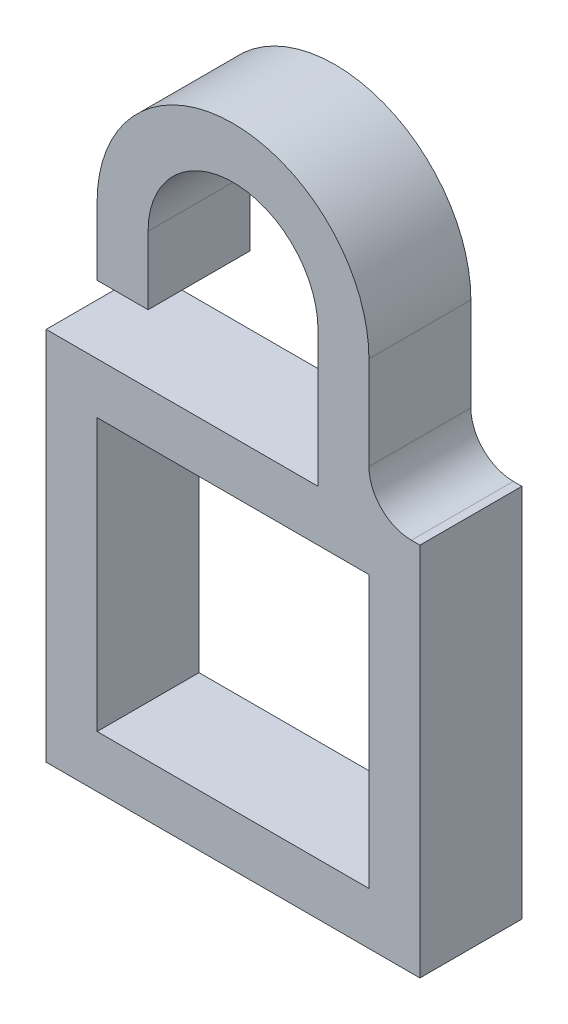
ISO-10303-21;
HEADER;
FILE_DESCRIPTION(('STEP AP214'),'2;1');
FILE_NAME('part.step','',(''),(''),'','','');
FILE_SCHEMA(('AUTOMOTIVE_DESIGN { 1 0 10303 214 1 1 1 1 }'));
ENDSEC;
DATA;
#1=APPLICATION_CONTEXT('core data for automotive mechanical design processes');
#2=APPLICATION_PROTOCOL_DEFINITION('international standard','automotive_design',2000,#1);
#3=PRODUCT_CONTEXT('',#1,'mechanical');
#4=PRODUCT('Part','Part','',(#3));
#5=PRODUCT_RELATED_PRODUCT_CATEGORY('part','',(#4));
#6=PRODUCT_DEFINITION_FORMATION('','',#4);
#7=PRODUCT_DEFINITION_CONTEXT('part definition',#1,'design');
#8=PRODUCT_DEFINITION('design','',#6,#7);
#9=PRODUCT_DEFINITION_SHAPE('','',#8);
#10=(LENGTH_UNIT() NAMED_UNIT(*) SI_UNIT(.MILLI.,.METRE.));
#11=(NAMED_UNIT(*) PLANE_ANGLE_UNIT() SI_UNIT($,.RADIAN.));
#12=(NAMED_UNIT(*) SI_UNIT($,.STERADIAN.) SOLID_ANGLE_UNIT());
#13=UNCERTAINTY_MEASURE_WITH_UNIT(LENGTH_MEASURE(1.E-05),#10,'distance_accuracy_value','');
#14=(GEOMETRIC_REPRESENTATION_CONTEXT(3) GLOBAL_UNCERTAINTY_ASSIGNED_CONTEXT((#13)) GLOBAL_UNIT_ASSIGNED_CONTEXT((#10,
#11,#12)) REPRESENTATION_CONTEXT('',''));
#15=CARTESIAN_POINT('',(0.,0.,0.));
#16=DIRECTION('',(0.,0.,1.));
#17=DIRECTION('',(1.,0.,0.));
#18=AXIS2_PLACEMENT_3D('',#15,#16,#17);
#19=CARTESIAN_POINT('',(16.,0.,12.));
#20=DIRECTION('',(1.,0.,0.));
#21=DIRECTION('',(0.,1.,0.));
#22=AXIS2_PLACEMENT_3D('',#19,#20,#21);
#23=PLANE('',#22);
#24=DIRECTION('',(0.,-1.,0.));
#25=VECTOR('',#24,1.);
#26=CARTESIAN_POINT('',(16.,0.,0.));
#27=LINE('',#26,#25);
#28=CARTESIAN_POINT('',(16.,-22.,0.));
#29=VERTEX_POINT('',#28);
#30=CARTESIAN_POINT('',(16.,-54.,0.));
#31=VERTEX_POINT('',#30);
#32=EDGE_CURVE('E258',#29,#31,#27,.T.);
#33=ORIENTED_EDGE('',*,*,#32,.T.);
#34=DIRECTION('',(0.,0.,-1.));
#35=VECTOR('',#34,1.);
#36=CARTESIAN_POINT('',(16.,-54.,12.));
#37=LINE('',#36,#35);
#38=CARTESIAN_POINT('',(16.,-54.,12.));
#39=VERTEX_POINT('',#38);
#40=EDGE_CURVE('E189',#39,#31,#37,.T.);
#41=ORIENTED_EDGE('',*,*,#40,.F.);
#42=DIRECTION('',(0.,-1.,0.));
#43=VECTOR('',#42,1.);
#44=CARTESIAN_POINT('',(16.,0.,12.));
#45=LINE('',#44,#43);
#46=CARTESIAN_POINT('',(16.,-22.,12.));
#47=VERTEX_POINT('',#46);
#48=EDGE_CURVE('E280',#47,#39,#45,.T.);
#49=ORIENTED_EDGE('',*,*,#48,.F.);
#50=DIRECTION('',(0.,0.,-1.));
#51=VECTOR('',#50,1.);
#52=CARTESIAN_POINT('',(16.,-22.,12.));
#53=LINE('',#52,#51);
#54=EDGE_CURVE('E178',#47,#29,#53,.T.);
#55=ORIENTED_EDGE('',*,*,#54,.T.);
#56=EDGE_LOOP('',(#33,#41,#49,#55));
#57=FACE_BOUND('',#56,.T.);
#58=ADVANCED_FACE('F35',(#57),#23,.F.);
#59=CARTESIAN_POINT('',(0.,-54.,12.));
#60=DIRECTION('',(0.,1.,0.));
#61=DIRECTION('',(0.,0.,1.));
#62=AXIS2_PLACEMENT_3D('',#59,#60,#61);
#63=PLANE('',#62);
#64=DIRECTION('',(1.,0.,0.));
#65=VECTOR('',#64,1.);
#66=CARTESIAN_POINT('',(0.,-54.,0.));
#67=LINE('',#66,#65);
#68=CARTESIAN_POINT('',(-16.,-54.,0.));
#69=VERTEX_POINT('',#68);
#70=EDGE_CURVE('E260',#69,#31,#67,.T.);
#71=ORIENTED_EDGE('',*,*,#70,.F.);
#72=DIRECTION('',(0.,0.,-1.));
#73=VECTOR('',#72,1.);
#74=CARTESIAN_POINT('',(-16.,-54.,12.));
#75=LINE('',#74,#73);
#76=CARTESIAN_POINT('',(-16.,-54.,12.));
#77=VERTEX_POINT('',#76);
#78=EDGE_CURVE('E193',#77,#69,#75,.T.);
#79=ORIENTED_EDGE('',*,*,#78,.F.);
#80=DIRECTION('',(1.,0.,0.));
#81=VECTOR('',#80,1.);
#82=CARTESIAN_POINT('',(0.,-54.,12.));
#83=LINE('',#82,#81);
#84=EDGE_CURVE('E282',#77,#39,#83,.T.);
#85=ORIENTED_EDGE('',*,*,#84,.T.);
#86=ORIENTED_EDGE('',*,*,#40,.T.);
#87=EDGE_LOOP('',(#71,#79,#85,#86));
#88=FACE_BOUND('',#87,.T.);
#89=ADVANCED_FACE('F307',(#88),#63,.T.);
#90=CARTESIAN_POINT('',(-16.,0.,12.));
#91=DIRECTION('',(1.,0.,0.));
#92=DIRECTION('',(0.,1.,0.));
#93=AXIS2_PLACEMENT_3D('',#90,#91,#92);
#94=PLANE('',#93);
#95=DIRECTION('',(0.,-1.,0.));
#96=VECTOR('',#95,1.);
#97=CARTESIAN_POINT('',(-16.,0.,0.));
#98=LINE('',#97,#96);
#99=CARTESIAN_POINT('',(-16.,-22.,0.));
#100=VERTEX_POINT('',#99);
#101=EDGE_CURVE('E263',#100,#69,#98,.T.);
#102=ORIENTED_EDGE('',*,*,#101,.F.);
#103=DIRECTION('',(0.,0.,-1.));
#104=VECTOR('',#103,1.);
#105=CARTESIAN_POINT('',(-16.,-22.,12.));
#106=LINE('',#105,#104);
#107=CARTESIAN_POINT('',(-16.,-22.,12.));
#108=VERTEX_POINT('',#107);
#109=EDGE_CURVE('E180',#108,#100,#106,.T.);
#110=ORIENTED_EDGE('',*,*,#109,.F.);
#111=DIRECTION('',(0.,-1.,0.));
#112=VECTOR('',#111,1.);
#113=CARTESIAN_POINT('',(-16.,0.,12.));
#114=LINE('',#113,#112);
#115=EDGE_CURVE('E284',#108,#77,#114,.T.);
#116=ORIENTED_EDGE('',*,*,#115,.T.);
#117=ORIENTED_EDGE('',*,*,#78,.T.);
#118=EDGE_LOOP('',(#102,#110,#116,#117));
#119=FACE_BOUND('',#118,.T.);
#120=ADVANCED_FACE('F276',(#119),#94,.T.);
#121=CARTESIAN_POINT('',(0.,-60.1297514100025,12.));
#122=DIRECTION('',(0.,1.,0.));
#123=DIRECTION('',(0.,0.,1.));
#124=AXIS2_PLACEMENT_3D('',#121,#122,#123);
#125=PLANE('',#124);
#126=DIRECTION('',(1.,0.,0.));
#127=VECTOR('',#126,1.);
#128=CARTESIAN_POINT('',(0.,-60.1297514100025,0.));
#129=LINE('',#128,#127);
#130=CARTESIAN_POINT('',(-22.,-60.1297514100025,0.));
#131=VERTEX_POINT('',#130);
#132=CARTESIAN_POINT('',(22.,-60.1297514100025,0.));
#133=VERTEX_POINT('',#132);
#134=EDGE_CURVE('E177',#131,#133,#129,.T.);
#135=ORIENTED_EDGE('',*,*,#134,.T.);
#136=DIRECTION('',(0.,0.,-1.));
#137=VECTOR('',#136,1.);
#138=CARTESIAN_POINT('',(22.,-60.1297514100025,12.));
#139=LINE('',#138,#137);
#140=CARTESIAN_POINT('',(22.,-60.1297514100025,12.));
#141=VERTEX_POINT('',#140);
#142=EDGE_CURVE('E158',#141,#133,#139,.T.);
#143=ORIENTED_EDGE('',*,*,#142,.F.);
#144=DIRECTION('',(1.,0.,0.));
#145=VECTOR('',#144,1.);
#146=CARTESIAN_POINT('',(0.,-60.1297514100025,12.));
#147=LINE('',#146,#145);
#148=CARTESIAN_POINT('',(-22.,-60.1297514100025,12.));
#149=VERTEX_POINT('',#148);
#150=EDGE_CURVE('E164',#149,#141,#147,.T.);
#151=ORIENTED_EDGE('',*,*,#150,.F.);
#152=DIRECTION('',(0.,0.,-1.));
#153=VECTOR('',#152,1.);
#154=CARTESIAN_POINT('',(-22.,-60.1297514100025,12.));
#155=LINE('',#154,#153);
#156=EDGE_CURVE('E203',#149,#131,#155,.T.);
#157=ORIENTED_EDGE('',*,*,#156,.T.);
#158=EDGE_LOOP('',(#135,#143,#151,#157));
#159=FACE_BOUND('',#158,.T.);
#160=ADVANCED_FACE('F175',(#159),#125,.F.);
#161=CARTESIAN_POINT('',(22.,0.,12.));
#162=DIRECTION('',(-1.,0.,0.));
#163=DIRECTION('',(0.,0.,1.));
#164=AXIS2_PLACEMENT_3D('',#161,#162,#163);
#165=PLANE('',#164);
#166=DIRECTION('',(0.,1.,0.));
#167=VECTOR('',#166,1.);
#168=CARTESIAN_POINT('',(22.,0.,0.));
#169=LINE('',#168,#167);
#170=CARTESIAN_POINT('',(22.,-16.,0.));
#171=VERTEX_POINT('',#170);
#172=EDGE_CURVE('E290',#133,#171,#169,.T.);
#173=ORIENTED_EDGE('',*,*,#172,.T.);
#174=DIRECTION('',(0.,0.,-1.));
#175=VECTOR('',#174,1.);
#176=CARTESIAN_POINT('',(22.,-16.,12.));
#177=LINE('',#176,#175);
#178=CARTESIAN_POINT('',(22.,-16.,12.));
#179=VERTEX_POINT('',#178);
#180=EDGE_CURVE('E161',#179,#171,#177,.T.);
#181=ORIENTED_EDGE('',*,*,#180,.F.);
#182=DIRECTION('',(0.,1.,0.));
#183=VECTOR('',#182,1.);
#184=CARTESIAN_POINT('',(22.,0.,12.));
#185=LINE('',#184,#183);
#186=EDGE_CURVE('E154',#141,#179,#185,.T.);
#187=ORIENTED_EDGE('',*,*,#186,.F.);
#188=ORIENTED_EDGE('',*,*,#142,.T.);
#189=EDGE_LOOP('',(#173,#181,#187,#188));
#190=FACE_BOUND('',#189,.T.);
#191=ADVANCED_FACE('F156',(#190),#165,.F.);
#192=CARTESIAN_POINT('',(0.,-16.,12.));
#193=DIRECTION('',(0.,-1.,0.));
#194=DIRECTION('',(1.,0.,0.));
#195=AXIS2_PLACEMENT_3D('',#192,#193,#194);
#196=PLANE('',#195);
#197=DIRECTION('',(-1.,0.,0.));
#198=VECTOR('',#197,1.);
#199=CARTESIAN_POINT('',(0.,-16.,0.));
#200=LINE('',#199,#198);
#201=CARTESIAN_POINT('',(21.,-16.,0.));
#202=VERTEX_POINT('',#201);
#203=EDGE_CURVE('E240',#171,#202,#200,.T.);
#204=ORIENTED_EDGE('',*,*,#203,.T.);
#205=DIRECTION('',(0.,0.,-1.));
#206=VECTOR('',#205,1.);
#207=CARTESIAN_POINT('',(21.,-16.,12.));
#208=LINE('',#207,#206);
#209=CARTESIAN_POINT('',(21.,-16.,12.));
#210=VERTEX_POINT('',#209);
#211=EDGE_CURVE('E50',#202,#210,#208,.F.);
#212=ORIENTED_EDGE('',*,*,#211,.T.);
#213=DIRECTION('',(-1.,0.,0.));
#214=VECTOR('',#213,1.);
#215=CARTESIAN_POINT('',(0.,-16.,12.));
#216=LINE('',#215,#214);
#217=EDGE_CURVE('E163',#179,#210,#216,.T.);
#218=ORIENTED_EDGE('',*,*,#217,.F.);
#219=ORIENTED_EDGE('',*,*,#180,.T.);
#220=EDGE_LOOP('',(#204,#212,#218,#219));
#221=FACE_BOUND('',#220,.T.);
#222=ADVANCED_FACE('F323',(#221),#196,.F.);
#223=CARTESIAN_POINT('',(16.,0.,12.));
#224=DIRECTION('',(-1.,0.,0.));
#225=DIRECTION('',(0.,0.,1.));
#226=AXIS2_PLACEMENT_3D('',#223,#224,#225);
#227=PLANE('',#226);
#228=DIRECTION('',(0.,1.,0.));
#229=VECTOR('',#228,1.);
#230=CARTESIAN_POINT('',(16.,0.,12.));
#231=LINE('',#230,#229);
#232=CARTESIAN_POINT('',(16.,-11.,12.));
#233=VERTEX_POINT('',#232);
#234=CARTESIAN_POINT('',(16.,0.,12.));
#235=VERTEX_POINT('',#234);
#236=EDGE_CURVE('E519',#233,#235,#231,.T.);
#237=ORIENTED_EDGE('',*,*,#236,.F.);
#238=DIRECTION('',(0.,0.,-1.));
#239=VECTOR('',#238,1.);
#240=CARTESIAN_POINT('',(16.,-11.,0.));
#241=LINE('',#240,#239);
#242=CARTESIAN_POINT('',(16.,-11.,0.));
#243=VERTEX_POINT('',#242);
#244=EDGE_CURVE('E186',#233,#243,#241,.T.);
#245=ORIENTED_EDGE('',*,*,#244,.T.);
#246=DIRECTION('',(0.,1.,0.));
#247=VECTOR('',#246,1.);
#248=CARTESIAN_POINT('',(16.,0.,0.));
#249=LINE('',#248,#247);
#250=CARTESIAN_POINT('',(16.,0.,0.));
#251=VERTEX_POINT('',#250);
#252=EDGE_CURVE('E233',#243,#251,#249,.T.);
#253=ORIENTED_EDGE('',*,*,#252,.T.);
#254=DIRECTION('',(0.,0.,-1.));
#255=VECTOR('',#254,1.);
#256=CARTESIAN_POINT('',(16.,0.,12.));
#257=LINE('',#256,#255);
#258=EDGE_CURVE('E182',#235,#251,#257,.T.);
#259=ORIENTED_EDGE('',*,*,#258,.F.);
#260=EDGE_LOOP('',(#237,#245,#253,#259));
#261=FACE_BOUND('',#260,.T.);
#262=ADVANCED_FACE('F345',(#261),#227,.F.);
#263=CARTESIAN_POINT('',(0.,0.,12.));
#264=DIRECTION('',(0.,0.,-1.));
#265=DIRECTION('',(-1.,0.,0.));
#266=AXIS2_PLACEMENT_3D('',#263,#264,#265);
#267=CYLINDRICAL_SURFACE('',#266,16.);
#268=CARTESIAN_POINT('',(0.,0.,0.));
#269=DIRECTION('',(0.,0.,1.));
#270=DIRECTION('',(1.,0.,0.));
#271=AXIS2_PLACEMENT_3D('',#268,#269,#270);
#272=CIRCLE('',#271,16.);
#273=CARTESIAN_POINT('',(-16.,0.,0.));
#274=VERTEX_POINT('',#273);
#275=EDGE_CURVE('E228',#251,#274,#272,.T.);
#276=ORIENTED_EDGE('',*,*,#275,.T.);
#277=DIRECTION('',(0.,0.,-1.));
#278=VECTOR('',#277,1.);
#279=CARTESIAN_POINT('',(-16.,0.,12.));
#280=LINE('',#279,#278);
#281=CARTESIAN_POINT('',(-16.,0.,12.));
#282=VERTEX_POINT('',#281);
#283=EDGE_CURVE('E219',#282,#274,#280,.T.);
#284=ORIENTED_EDGE('',*,*,#283,.F.);
#285=CARTESIAN_POINT('',(0.,0.,12.));
#286=DIRECTION('',(0.,0.,1.));
#287=DIRECTION('',(1.,0.,0.));
#288=AXIS2_PLACEMENT_3D('',#285,#286,#287);
#289=CIRCLE('',#288,16.);
#290=EDGE_CURVE('E230',#235,#282,#289,.T.);
#291=ORIENTED_EDGE('',*,*,#290,.F.);
#292=ORIENTED_EDGE('',*,*,#258,.T.);
#293=EDGE_LOOP('',(#276,#284,#291,#292));
#294=FACE_BOUND('',#293,.T.);
#295=ADVANCED_FACE('F226',(#294),#267,.T.);
#296=CARTESIAN_POINT('',(-16.,0.,12.));
#297=DIRECTION('',(-1.,0.,0.));
#298=DIRECTION('',(0.,0.,1.));
#299=AXIS2_PLACEMENT_3D('',#296,#297,#298);
#300=PLANE('',#299);
#301=DIRECTION('',(0.,1.,0.));
#302=VECTOR('',#301,1.);
#303=CARTESIAN_POINT('',(-16.,0.,0.));
#304=LINE('',#303,#302);
#305=CARTESIAN_POINT('',(-16.,-8.,0.));
#306=VERTEX_POINT('',#305);
#307=EDGE_CURVE('E236',#306,#274,#304,.T.);
#308=ORIENTED_EDGE('',*,*,#307,.F.);
#309=DIRECTION('',(0.,0.,-1.));
#310=VECTOR('',#309,1.);
#311=CARTESIAN_POINT('',(-16.,-8.,12.));
#312=LINE('',#311,#310);
#313=CARTESIAN_POINT('',(-16.,-8.,12.));
#314=VERTEX_POINT('',#313);
#315=EDGE_CURVE('E217',#314,#306,#312,.T.);
#316=ORIENTED_EDGE('',*,*,#315,.F.);
#317=DIRECTION('',(0.,1.,0.));
#318=VECTOR('',#317,1.);
#319=CARTESIAN_POINT('',(-16.,0.,12.));
#320=LINE('',#319,#318);
#321=EDGE_CURVE('E521',#314,#282,#320,.T.);
#322=ORIENTED_EDGE('',*,*,#321,.T.);
#323=ORIENTED_EDGE('',*,*,#283,.T.);
#324=EDGE_LOOP('',(#308,#316,#322,#323));
#325=FACE_BOUND('',#324,.T.);
#326=ADVANCED_FACE('F338',(#325),#300,.T.);
#327=CARTESIAN_POINT('',(0.,-8.,12.));
#328=DIRECTION('',(0.,1.,0.));
#329=DIRECTION('',(0.,0.,1.));
#330=AXIS2_PLACEMENT_3D('',#327,#328,#329);
#331=PLANE('',#330);
#332=DIRECTION('',(1.,0.,0.));
#333=VECTOR('',#332,1.);
#334=CARTESIAN_POINT('',(0.,-8.,0.));
#335=LINE('',#334,#333);
#336=CARTESIAN_POINT('',(-10.,-8.,0.));
#337=VERTEX_POINT('',#336);
#338=EDGE_CURVE('E238',#306,#337,#335,.T.);
#339=ORIENTED_EDGE('',*,*,#338,.T.);
#340=DIRECTION('',(0.,0.,-1.));
#341=VECTOR('',#340,1.);
#342=CARTESIAN_POINT('',(-10.,-8.,12.));
#343=LINE('',#342,#341);
#344=CARTESIAN_POINT('',(-10.,-8.,12.));
#345=VERTEX_POINT('',#344);
#346=EDGE_CURVE('E214',#345,#337,#343,.T.);
#347=ORIENTED_EDGE('',*,*,#346,.F.);
#348=DIRECTION('',(1.,0.,0.));
#349=VECTOR('',#348,1.);
#350=CARTESIAN_POINT('',(0.,-8.,12.));
#351=LINE('',#350,#349);
#352=EDGE_CURVE('E526',#314,#345,#351,.T.);
#353=ORIENTED_EDGE('',*,*,#352,.F.);
#354=ORIENTED_EDGE('',*,*,#315,.T.);
#355=EDGE_LOOP('',(#339,#347,#353,#354));
#356=FACE_BOUND('',#355,.T.);
#357=ADVANCED_FACE('F334',(#356),#331,.F.);
#358=CARTESIAN_POINT('',(-10.,0.,12.));
#359=DIRECTION('',(-1.,0.,0.));
#360=DIRECTION('',(0.,0.,1.));
#361=AXIS2_PLACEMENT_3D('',#358,#359,#360);
#362=PLANE('',#361);
#363=DIRECTION('',(0.,1.,0.));
#364=VECTOR('',#363,1.);
#365=CARTESIAN_POINT('',(-10.,0.,0.));
#366=LINE('',#365,#364);
#367=CARTESIAN_POINT('',(-10.,0.,0.));
#368=VERTEX_POINT('',#367);
#369=EDGE_CURVE('E245',#337,#368,#366,.T.);
#370=ORIENTED_EDGE('',*,*,#369,.T.);
#371=DIRECTION('',(0.,0.,-1.));
#372=VECTOR('',#371,1.);
#373=CARTESIAN_POINT('',(-10.,0.,12.));
#374=LINE('',#373,#372);
#375=CARTESIAN_POINT('',(-10.,0.,12.));
#376=VERTEX_POINT('',#375);
#377=EDGE_CURVE('E212',#376,#368,#374,.T.);
#378=ORIENTED_EDGE('',*,*,#377,.F.);
#379=DIRECTION('',(0.,1.,0.));
#380=VECTOR('',#379,1.);
#381=CARTESIAN_POINT('',(-10.,0.,12.));
#382=LINE('',#381,#380);
#383=EDGE_CURVE('E528',#345,#376,#382,.T.);
#384=ORIENTED_EDGE('',*,*,#383,.F.);
#385=ORIENTED_EDGE('',*,*,#346,.T.);
#386=EDGE_LOOP('',(#370,#378,#384,#385));
#387=FACE_BOUND('',#386,.T.);
#388=ADVANCED_FACE('F330',(#387),#362,.F.);
#389=CARTESIAN_POINT('',(0.,0.,12.));
#390=DIRECTION('',(0.,0.,-1.));
#391=DIRECTION('',(-1.,0.,0.));
#392=AXIS2_PLACEMENT_3D('',#389,#390,#391);
#393=CYLINDRICAL_SURFACE('',#392,10.);
#394=CARTESIAN_POINT('',(0.,0.,0.));
#395=DIRECTION('',(0.,0.,1.));
#396=DIRECTION('',(1.,0.,0.));
#397=AXIS2_PLACEMENT_3D('',#394,#395,#396);
#398=CIRCLE('',#397,10.);
#399=CARTESIAN_POINT('',(10.,0.,0.));
#400=VERTEX_POINT('',#399);
#401=EDGE_CURVE('E248',#400,#368,#398,.T.);
#402=ORIENTED_EDGE('',*,*,#401,.F.);
#403=DIRECTION('',(0.,0.,-1.));
#404=VECTOR('',#403,1.);
#405=CARTESIAN_POINT('',(10.,0.,12.));
#406=LINE('',#405,#404);
#407=CARTESIAN_POINT('',(10.,0.,12.));
#408=VERTEX_POINT('',#407);
#409=EDGE_CURVE('E210',#408,#400,#406,.T.);
#410=ORIENTED_EDGE('',*,*,#409,.F.);
#411=CARTESIAN_POINT('',(0.,0.,12.));
#412=DIRECTION('',(0.,0.,1.));
#413=DIRECTION('',(1.,0.,0.));
#414=AXIS2_PLACEMENT_3D('',#411,#412,#413);
#415=CIRCLE('',#414,10.);
#416=EDGE_CURVE('E529',#408,#376,#415,.T.);
#417=ORIENTED_EDGE('',*,*,#416,.T.);
#418=ORIENTED_EDGE('',*,*,#377,.T.);
#419=EDGE_LOOP('',(#402,#410,#417,#418));
#420=FACE_BOUND('',#419,.T.);
#421=ADVANCED_FACE('F326',(#420),#393,.F.);
#422=CARTESIAN_POINT('',(10.,0.,12.));
#423=DIRECTION('',(-1.,0.,0.));
#424=DIRECTION('',(0.,-1.,0.));
#425=AXIS2_PLACEMENT_3D('',#422,#423,#424);
#426=PLANE('',#425);
#427=DIRECTION('',(0.,1.,0.));
#428=VECTOR('',#427,1.);
#429=CARTESIAN_POINT('',(10.,0.,0.));
#430=LINE('',#429,#428);
#431=CARTESIAN_POINT('',(10.,-16.,0.));
#432=VERTEX_POINT('',#431);
#433=EDGE_CURVE('E251',#432,#400,#430,.T.);
#434=ORIENTED_EDGE('',*,*,#433,.F.);
#435=DIRECTION('',(0.,0.,-1.));
#436=VECTOR('',#435,1.);
#437=CARTESIAN_POINT('',(10.,-16.,12.));
#438=LINE('',#437,#436);
#439=CARTESIAN_POINT('',(10.,-16.,12.));
#440=VERTEX_POINT('',#439);
#441=EDGE_CURVE('E208',#440,#432,#438,.T.);
#442=ORIENTED_EDGE('',*,*,#441,.F.);
#443=DIRECTION('',(0.,1.,0.));
#444=VECTOR('',#443,1.);
#445=CARTESIAN_POINT('',(10.,0.,12.));
#446=LINE('',#445,#444);
#447=EDGE_CURVE('E303',#440,#408,#446,.T.);
#448=ORIENTED_EDGE('',*,*,#447,.T.);
#449=ORIENTED_EDGE('',*,*,#409,.T.);
#450=EDGE_LOOP('',(#434,#442,#448,#449));
#451=FACE_BOUND('',#450,.T.);
#452=ADVANCED_FACE('F322',(#451),#426,.T.);
#453=CARTESIAN_POINT('',(-22.,-16.,0.));
#454=VERTEX_POINT('',#453);
#455=EDGE_CURVE('E254',#432,#454,#200,.T.);
#456=ORIENTED_EDGE('',*,*,#455,.T.);
#457=DIRECTION('',(0.,0.,-1.));
#458=VECTOR('',#457,1.);
#459=CARTESIAN_POINT('',(-22.,-16.,12.));
#460=LINE('',#459,#458);
#461=CARTESIAN_POINT('',(-22.,-16.,12.));
#462=VERTEX_POINT('',#461);
#463=EDGE_CURVE('E205',#462,#454,#460,.T.);
#464=ORIENTED_EDGE('',*,*,#463,.F.);
#465=EDGE_CURVE('E301',#440,#462,#216,.T.);
#466=ORIENTED_EDGE('',*,*,#465,.F.);
#467=ORIENTED_EDGE('',*,*,#441,.T.);
#468=EDGE_LOOP('',(#456,#464,#466,#467));
#469=FACE_BOUND('',#468,.T.);
#470=ADVANCED_FACE('F295',(#469),#196,.F.);
#471=CARTESIAN_POINT('',(-22.,0.,12.));
#472=DIRECTION('',(-1.,0.,0.));
#473=DIRECTION('',(0.,0.,1.));
#474=AXIS2_PLACEMENT_3D('',#471,#472,#473);
#475=PLANE('',#474);
#476=DIRECTION('',(0.,1.,0.));
#477=VECTOR('',#476,1.);
#478=CARTESIAN_POINT('',(-22.,0.,0.));
#479=LINE('',#478,#477);
#480=EDGE_CURVE('E255',#131,#454,#479,.T.);
#481=ORIENTED_EDGE('',*,*,#480,.F.);
#482=ORIENTED_EDGE('',*,*,#156,.F.);
#483=DIRECTION('',(0.,1.,0.));
#484=VECTOR('',#483,1.);
#485=CARTESIAN_POINT('',(-22.,0.,12.));
#486=LINE('',#485,#484);
#487=EDGE_CURVE('E171',#149,#462,#486,.T.);
#488=ORIENTED_EDGE('',*,*,#487,.T.);
#489=ORIENTED_EDGE('',*,*,#463,.T.);
#490=EDGE_LOOP('',(#481,#482,#488,#489));
#491=FACE_BOUND('',#490,.T.);
#492=ADVANCED_FACE('F300',(#491),#475,.T.);
#493=CARTESIAN_POINT('',(0.,-22.,12.));
#494=DIRECTION('',(0.,-1.,0.));
#495=DIRECTION('',(0.,0.,-1.));
#496=AXIS2_PLACEMENT_3D('',#493,#494,#495);
#497=PLANE('',#496);
#498=DIRECTION('',(-1.,0.,0.));
#499=VECTOR('',#498,1.);
#500=CARTESIAN_POINT('',(0.,-22.,0.));
#501=LINE('',#500,#499);
#502=EDGE_CURVE('E173',#29,#100,#501,.T.);
#503=ORIENTED_EDGE('',*,*,#502,.F.);
#504=ORIENTED_EDGE('',*,*,#54,.F.);
#505=DIRECTION('',(-1.,0.,0.));
#506=VECTOR('',#505,1.);
#507=CARTESIAN_POINT('',(0.,-22.,12.));
#508=LINE('',#507,#506);
#509=EDGE_CURVE('E206',#47,#108,#508,.T.);
#510=ORIENTED_EDGE('',*,*,#509,.T.);
#511=ORIENTED_EDGE('',*,*,#109,.T.);
#512=EDGE_LOOP('',(#503,#504,#510,#511));
#513=FACE_BOUND('',#512,.T.);
#514=ADVANCED_FACE('F271',(#513),#497,.T.);
#515=CARTESIAN_POINT('',(0.,0.,12.));
#516=DIRECTION('',(0.,0.,1.));
#517=DIRECTION('',(1.,0.,0.));
#518=AXIS2_PLACEMENT_3D('',#515,#516,#517);
#519=PLANE('',#518);
#520=ORIENTED_EDGE('',*,*,#150,.T.);
#521=ORIENTED_EDGE('',*,*,#186,.T.);
#522=ORIENTED_EDGE('',*,*,#217,.T.);
#523=CARTESIAN_POINT('',(21.,-11.,12.));
#524=DIRECTION('',(0.,0.,1.));
#525=DIRECTION('',(1.,0.,0.));
#526=AXIS2_PLACEMENT_3D('',#523,#524,#525);
#527=CIRCLE('',#526,5.);
#528=EDGE_CURVE('E11',#210,#233,#527,.F.);
#529=ORIENTED_EDGE('',*,*,#528,.T.);
#530=ORIENTED_EDGE('',*,*,#236,.T.);
#531=ORIENTED_EDGE('',*,*,#290,.T.);
#532=ORIENTED_EDGE('',*,*,#321,.F.);
#533=ORIENTED_EDGE('',*,*,#352,.T.);
#534=ORIENTED_EDGE('',*,*,#383,.T.);
#535=ORIENTED_EDGE('',*,*,#416,.F.);
#536=ORIENTED_EDGE('',*,*,#447,.F.);
#537=ORIENTED_EDGE('',*,*,#465,.T.);
#538=ORIENTED_EDGE('',*,*,#487,.F.);
#539=EDGE_LOOP('',(#520,#521,#522,#529,#530,#531,#532,#533,#534,#535,#536,#537,#538));
#540=FACE_BOUND('',#539,.T.);
#541=ORIENTED_EDGE('',*,*,#48,.T.);
#542=ORIENTED_EDGE('',*,*,#84,.F.);
#543=ORIENTED_EDGE('',*,*,#115,.F.);
#544=ORIENTED_EDGE('',*,*,#509,.F.);
#545=EDGE_LOOP('',(#541,#542,#543,#544));
#546=FACE_BOUND('',#545,.T.);
#547=ADVANCED_FACE('F168',(#540,#546),#519,.T.);
#548=CARTESIAN_POINT('',(0.,0.,0.));
#549=DIRECTION('',(0.,0.,1.));
#550=DIRECTION('',(1.,0.,0.));
#551=AXIS2_PLACEMENT_3D('',#548,#549,#550);
#552=PLANE('',#551);
#553=ORIENTED_EDGE('',*,*,#134,.F.);
#554=ORIENTED_EDGE('',*,*,#480,.T.);
#555=ORIENTED_EDGE('',*,*,#455,.F.);
#556=ORIENTED_EDGE('',*,*,#433,.T.);
#557=ORIENTED_EDGE('',*,*,#401,.T.);
#558=ORIENTED_EDGE('',*,*,#369,.F.);
#559=ORIENTED_EDGE('',*,*,#338,.F.);
#560=ORIENTED_EDGE('',*,*,#307,.T.);
#561=ORIENTED_EDGE('',*,*,#275,.F.);
#562=ORIENTED_EDGE('',*,*,#252,.F.);
#563=CARTESIAN_POINT('',(21.,-11.,0.));
#564=DIRECTION('',(0.,0.,1.));
#565=DIRECTION('',(1.,0.,0.));
#566=AXIS2_PLACEMENT_3D('',#563,#564,#565);
#567=CIRCLE('',#566,5.);
#568=EDGE_CURVE('E43',#243,#202,#567,.T.);
#569=ORIENTED_EDGE('',*,*,#568,.T.);
#570=ORIENTED_EDGE('',*,*,#203,.F.);
#571=ORIENTED_EDGE('',*,*,#172,.F.);
#572=EDGE_LOOP('',(#553,#554,#555,#556,#557,#558,#559,#560,#561,#562,#569,#570,#571));
#573=FACE_BOUND('',#572,.T.);
#574=ORIENTED_EDGE('',*,*,#32,.F.);
#575=ORIENTED_EDGE('',*,*,#502,.T.);
#576=ORIENTED_EDGE('',*,*,#101,.T.);
#577=ORIENTED_EDGE('',*,*,#70,.T.);
#578=EDGE_LOOP('',(#574,#575,#576,#577));
#579=FACE_BOUND('',#578,.T.);
#580=ADVANCED_FACE('F231',(#573,#579),#552,.F.);
#581=CARTESIAN_POINT('',(21.,-11.,12.));
#582=DIRECTION('',(0.,0.,1.));
#583=DIRECTION('',(1.,0.,0.));
#584=AXIS2_PLACEMENT_3D('',#581,#582,#583);
#585=CYLINDRICAL_SURFACE('',#584,5.);
#586=ORIENTED_EDGE('',*,*,#528,.F.);
#587=ORIENTED_EDGE('',*,*,#211,.F.);
#588=ORIENTED_EDGE('',*,*,#568,.F.);
#589=ORIENTED_EDGE('',*,*,#244,.F.);
#590=EDGE_LOOP('',(#586,#587,#588,#589));
#591=FACE_BOUND('',#590,.T.);
#592=ADVANCED_FACE('F37',(#591),#585,.F.);
#593=CLOSED_SHELL('',(#58,#89,#120,#160,#191,#222,#262,#295,#326,#357,#388,#421,#452,#470,#492,
#514,#547,#580,#592));
#594=MANIFOLD_SOLID_BREP('B2',#593);
#595=ADVANCED_BREP_SHAPE_REPRESENTATION('',(#18,#594),#14);
#596=SHAPE_DEFINITION_REPRESENTATION(#9,#595);
ENDSEC;
END-ISO-10303-21;
